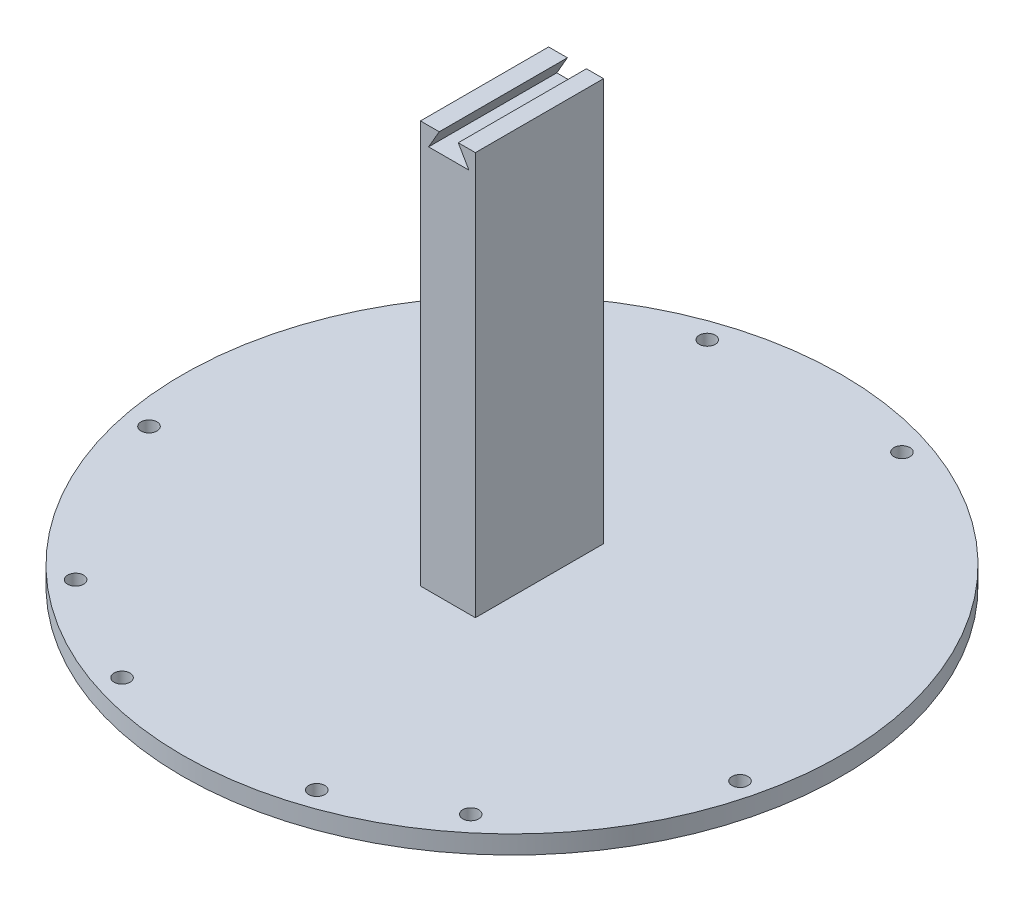
ISO-10303-21;
HEADER;
FILE_DESCRIPTION(('STEP AP214'),'2;1');
FILE_NAME('part.step','',(''),(''),'','','');
FILE_SCHEMA(('AUTOMOTIVE_DESIGN { 1 0 10303 214 1 1 1 1 }'));
ENDSEC;
DATA;
#1=APPLICATION_CONTEXT('core data for automotive mechanical design processes');
#2=APPLICATION_PROTOCOL_DEFINITION('international standard','automotive_design',2000,#1);
#3=PRODUCT_CONTEXT('',#1,'mechanical');
#4=PRODUCT('Part','Part','',(#3));
#5=PRODUCT_RELATED_PRODUCT_CATEGORY('part','',(#4));
#6=PRODUCT_DEFINITION_FORMATION('','',#4);
#7=PRODUCT_DEFINITION_CONTEXT('part definition',#1,'design');
#8=PRODUCT_DEFINITION('design','',#6,#7);
#9=PRODUCT_DEFINITION_SHAPE('','',#8);
#10=(LENGTH_UNIT() NAMED_UNIT(*) SI_UNIT(.MILLI.,.METRE.));
#11=(NAMED_UNIT(*) PLANE_ANGLE_UNIT() SI_UNIT($,.RADIAN.));
#12=(NAMED_UNIT(*) SI_UNIT($,.STERADIAN.) SOLID_ANGLE_UNIT());
#13=UNCERTAINTY_MEASURE_WITH_UNIT(LENGTH_MEASURE(1.E-05),#10,'distance_accuracy_value','');
#14=(GEOMETRIC_REPRESENTATION_CONTEXT(3) GLOBAL_UNCERTAINTY_ASSIGNED_CONTEXT((#13)) GLOBAL_UNIT_ASSIGNED_CONTEXT((#10,
#11,#12)) REPRESENTATION_CONTEXT('',''));
#15=CARTESIAN_POINT('',(0.,0.,0.));
#16=DIRECTION('',(0.,0.,1.));
#17=DIRECTION('',(1.,0.,0.));
#18=AXIS2_PLACEMENT_3D('',#15,#16,#17);
#19=CARTESIAN_POINT('',(0.,115.,0.));
#20=DIRECTION('',(0.,1.,0.));
#21=DIRECTION('',(0.,0.,1.));
#22=AXIS2_PLACEMENT_3D('',#19,#20,#21);
#23=PLANE('',#22);
#24=DIRECTION('',(0.,0.,-1.));
#25=VECTOR('',#24,1.);
#26=CARTESIAN_POINT('',(2.82644831534013,115.,0.));
#27=LINE('',#26,#25);
#28=CARTESIAN_POINT('',(2.82644831534013,115.,17.5));
#29=VERTEX_POINT('',#28);
#30=CARTESIAN_POINT('',(2.82644831534013,115.,-17.5));
#31=VERTEX_POINT('',#30);
#32=EDGE_CURVE('E60',#29,#31,#27,.T.);
#33=ORIENTED_EDGE('',*,*,#32,.F.);
#34=DIRECTION('',(1.,0.,0.));
#35=VECTOR('',#34,1.);
#36=CARTESIAN_POINT('',(7.5,115.,17.5));
#37=LINE('',#36,#35);
#38=CARTESIAN_POINT('',(7.5,115.,17.5));
#39=VERTEX_POINT('',#38);
#40=EDGE_CURVE('E133',#29,#39,#37,.T.);
#41=ORIENTED_EDGE('',*,*,#40,.T.);
#42=DIRECTION('',(0.,0.,-1.));
#43=VECTOR('',#42,1.);
#44=CARTESIAN_POINT('',(7.5,115.,17.5));
#45=LINE('',#44,#43);
#46=CARTESIAN_POINT('',(7.5,115.,-17.5));
#47=VERTEX_POINT('',#46);
#48=EDGE_CURVE('E151',#39,#47,#45,.T.);
#49=ORIENTED_EDGE('',*,*,#48,.T.);
#50=DIRECTION('',(-1.,0.,0.));
#51=VECTOR('',#50,1.);
#52=CARTESIAN_POINT('',(7.5,115.,-17.5));
#53=LINE('',#52,#51);
#54=EDGE_CURVE('E136',#47,#31,#53,.T.);
#55=ORIENTED_EDGE('',*,*,#54,.T.);
#56=EDGE_LOOP('',(#33,#41,#49,#55));
#57=FACE_BOUND('',#56,.T.);
#58=ADVANCED_FACE('F51',(#57),#23,.T.);
#59=CARTESIAN_POINT('',(0.,5.,0.));
#60=DIRECTION('',(0.,-1.,0.));
#61=DIRECTION('',(0.,0.,-1.));
#62=AXIS2_PLACEMENT_3D('',#59,#60,#61);
#63=CYLINDRICAL_SURFACE('',#62,90.);
#64=CARTESIAN_POINT('',(0.,5.,0.));
#65=DIRECTION('',(0.,1.,0.));
#66=DIRECTION('',(0.,0.,1.));
#67=AXIS2_PLACEMENT_3D('',#64,#65,#66);
#68=CIRCLE('',#67,90.);
#69=CARTESIAN_POINT('',(0.,5.,90.));
#70=VERTEX_POINT('',#69);
#71=EDGE_CURVE('E189',#70,#70,#68,.T.);
#72=ORIENTED_EDGE('',*,*,#71,.F.);
#73=EDGE_LOOP('',(#72));
#74=FACE_BOUND('',#73,.T.);
#75=CARTESIAN_POINT('',(0.,0.,0.));
#76=DIRECTION('',(0.,1.,0.));
#77=DIRECTION('',(0.,0.,1.));
#78=AXIS2_PLACEMENT_3D('',#75,#76,#77);
#79=CIRCLE('',#78,90.);
#80=CARTESIAN_POINT('',(0.,0.,90.));
#81=VERTEX_POINT('',#80);
#82=EDGE_CURVE('E188',#81,#81,#79,.T.);
#83=ORIENTED_EDGE('',*,*,#82,.T.);
#84=EDGE_LOOP('',(#83));
#85=FACE_BOUND('',#84,.T.);
#86=ADVANCED_FACE('F53',(#74,#85),#63,.T.);
#87=CARTESIAN_POINT('',(0.,5.,0.));
#88=DIRECTION('',(0.,1.,0.));
#89=DIRECTION('',(0.,0.,1.));
#90=AXIS2_PLACEMENT_3D('',#87,#88,#89);
#91=PLANE('',#90);
#92=CARTESIAN_POINT('',(-82.3103290653493,5.,16.825152102193));
#93=DIRECTION('',(0.,1.,0.));
#94=DIRECTION('',(0.,0.,1.));
#95=AXIS2_PLACEMENT_3D('',#92,#93,#94);
#96=CIRCLE('',#95,2.18255);
#97=CARTESIAN_POINT('',(-82.3103290653493,5.,19.007702102193));
#98=VERTEX_POINT('',#97);
#99=EDGE_CURVE('E129',#98,#98,#96,.T.);
#100=ORIENTED_EDGE('',*,*,#99,.F.);
#101=EDGE_LOOP('',(#100));
#102=FACE_BOUND('',#101,.T.);
#103=CARTESIAN_POINT('',(-56.093218167113,5.,63.0821731492684));
#104=DIRECTION('',(0.,1.,0.));
#105=DIRECTION('',(0.,0.,1.));
#106=AXIS2_PLACEMENT_3D('',#103,#104,#105);
#107=CIRCLE('',#106,2.18255);
#108=CARTESIAN_POINT('',(-56.093218167113,5.,65.2647231492684));
#109=VERTEX_POINT('',#108);
#110=EDGE_CURVE('E230',#109,#109,#107,.T.);
#111=ORIENTED_EDGE('',*,*,#110,.F.);
#112=EDGE_LOOP('',(#111));
#113=FACE_BOUND('',#112,.T.);
#114=CARTESIAN_POINT('',(-26.585,5.,79.9073252514612));
#115=DIRECTION('',(0.,1.,0.));
#116=DIRECTION('',(0.,0.,1.));
#117=AXIS2_PLACEMENT_3D('',#114,#115,#116);
#118=CIRCLE('',#117,2.18255);
#119=CARTESIAN_POINT('',(-26.585,5.,82.0898752514612));
#120=VERTEX_POINT('',#119);
#121=EDGE_CURVE('E234',#120,#120,#118,.T.);
#122=ORIENTED_EDGE('',*,*,#121,.F.);
#123=EDGE_LOOP('',(#122));
#124=FACE_BOUND('',#123,.T.);
#125=CARTESIAN_POINT('',(26.585,5.,79.9073252514612));
#126=DIRECTION('',(0.,1.,0.));
#127=DIRECTION('',(0.,0.,1.));
#128=AXIS2_PLACEMENT_3D('',#125,#126,#127);
#129=CIRCLE('',#128,2.18255);
#130=CARTESIAN_POINT('',(26.585,5.,82.0898752514612));
#131=VERTEX_POINT('',#130);
#132=EDGE_CURVE('E238',#131,#131,#129,.T.);
#133=ORIENTED_EDGE('',*,*,#132,.F.);
#134=EDGE_LOOP('',(#133));
#135=FACE_BOUND('',#134,.T.);
#136=CARTESIAN_POINT('',(82.2453022818043,5.,19.9780897386926));
#137=DIRECTION('',(0.,1.,0.));
#138=DIRECTION('',(0.,0.,1.));
#139=AXIS2_PLACEMENT_3D('',#136,#137,#138);
#140=CIRCLE('',#139,2.18255);
#141=CARTESIAN_POINT('',(82.2453022818043,5.,22.1606397386926));
#142=VERTEX_POINT('',#141);
#143=EDGE_CURVE('E242',#142,#142,#140,.T.);
#144=ORIENTED_EDGE('',*,*,#143,.F.);
#145=EDGE_LOOP('',(#144));
#146=FACE_BOUND('',#145,.T.);
#147=CARTESIAN_POINT('',(53.3465637883439,5.,64.6125029474108));
#148=DIRECTION('',(0.,1.,0.));
#149=DIRECTION('',(0.,0.,1.));
#150=AXIS2_PLACEMENT_3D('',#147,#148,#149);
#151=CIRCLE('',#150,2.18255);
#152=CARTESIAN_POINT('',(53.3465637883439,5.,66.7950529474108));
#153=VERTEX_POINT('',#152);
#154=EDGE_CURVE('E246',#153,#153,#151,.T.);
#155=ORIENTED_EDGE('',*,*,#154,.F.);
#156=EDGE_LOOP('',(#155));
#157=FACE_BOUND('',#156,.T.);
#158=CARTESIAN_POINT('',(26.5850000000001,5.,-79.9073252514612));
#159=DIRECTION('',(0.,1.,0.));
#160=DIRECTION('',(0.,0.,1.));
#161=AXIS2_PLACEMENT_3D('',#158,#159,#160);
#162=CIRCLE('',#161,2.18255);
#163=CARTESIAN_POINT('',(26.5850000000001,5.,-77.7247752514612));
#164=VERTEX_POINT('',#163);
#165=EDGE_CURVE('E250',#164,#164,#162,.T.);
#166=ORIENTED_EDGE('',*,*,#165,.F.);
#167=EDGE_LOOP('',(#166));
#168=FACE_BOUND('',#167,.T.);
#169=CARTESIAN_POINT('',(-26.585,5.,-79.9073252514612));
#170=DIRECTION('',(0.,1.,0.));
#171=DIRECTION('',(0.,0.,1.));
#172=AXIS2_PLACEMENT_3D('',#169,#170,#171);
#173=CIRCLE('',#172,2.18255);
#174=CARTESIAN_POINT('',(-26.585,5.,-77.7247752514612));
#175=VERTEX_POINT('',#174);
#176=EDGE_CURVE('E254',#175,#175,#173,.T.);
#177=ORIENTED_EDGE('',*,*,#176,.F.);
#178=EDGE_LOOP('',(#177));
#179=FACE_BOUND('',#178,.T.);
#180=DIRECTION('',(0.,0.,1.));
#181=VECTOR('',#180,1.);
#182=CARTESIAN_POINT('',(-7.5,5.,17.5));
#183=LINE('',#182,#181);
#184=CARTESIAN_POINT('',(-7.5,5.,-17.5));
#185=VERTEX_POINT('',#184);
#186=CARTESIAN_POINT('',(-7.5,5.,17.5));
#187=VERTEX_POINT('',#186);
#188=EDGE_CURVE('E75',#185,#187,#183,.T.);
#189=ORIENTED_EDGE('',*,*,#188,.F.);
#190=DIRECTION('',(-1.,0.,0.));
#191=VECTOR('',#190,1.);
#192=CARTESIAN_POINT('',(7.5,5.,-17.5));
#193=LINE('',#192,#191);
#194=CARTESIAN_POINT('',(7.5,5.,-17.5));
#195=VERTEX_POINT('',#194);
#196=EDGE_CURVE('E153',#195,#185,#193,.T.);
#197=ORIENTED_EDGE('',*,*,#196,.F.);
#198=DIRECTION('',(0.,0.,-1.));
#199=VECTOR('',#198,1.);
#200=CARTESIAN_POINT('',(7.5,5.,17.5));
#201=LINE('',#200,#199);
#202=CARTESIAN_POINT('',(7.5,5.,17.5));
#203=VERTEX_POINT('',#202);
#204=EDGE_CURVE('E169',#203,#195,#201,.T.);
#205=ORIENTED_EDGE('',*,*,#204,.F.);
#206=DIRECTION('',(1.,0.,0.));
#207=VECTOR('',#206,1.);
#208=CARTESIAN_POINT('',(7.5,5.,17.5));
#209=LINE('',#208,#207);
#210=EDGE_CURVE('E165',#187,#203,#209,.T.);
#211=ORIENTED_EDGE('',*,*,#210,.F.);
#212=EDGE_LOOP('',(#189,#197,#205,#211));
#213=FACE_BOUND('',#212,.T.);
#214=ORIENTED_EDGE('',*,*,#71,.T.);
#215=EDGE_LOOP('',(#214));
#216=FACE_BOUND('',#215,.T.);
#217=ADVANCED_FACE('F296',(#102,#113,#124,#135,#146,#157,#168,#179,#213,#216),#91,.T.);
#218=CARTESIAN_POINT('',(0.,0.,0.));
#219=DIRECTION('',(0.,1.,0.));
#220=DIRECTION('',(0.,0.,1.));
#221=AXIS2_PLACEMENT_3D('',#218,#219,#220);
#222=PLANE('',#221);
#223=CARTESIAN_POINT('',(-82.3103290653493,0.,16.825152102193));
#224=DIRECTION('',(0.,-1.,0.));
#225=DIRECTION('',(0.,0.,-1.));
#226=AXIS2_PLACEMENT_3D('',#223,#224,#225);
#227=CIRCLE('',#226,2.18255);
#228=CARTESIAN_POINT('',(-82.3103290653493,0.,14.642602102193));
#229=VERTEX_POINT('',#228);
#230=EDGE_CURVE('E258',#229,#229,#227,.T.);
#231=ORIENTED_EDGE('',*,*,#230,.F.);
#232=EDGE_LOOP('',(#231));
#233=FACE_BOUND('',#232,.T.);
#234=CARTESIAN_POINT('',(-56.093218167113,0.,63.0821731492684));
#235=DIRECTION('',(0.,-1.,0.));
#236=DIRECTION('',(0.,0.,-1.));
#237=AXIS2_PLACEMENT_3D('',#234,#235,#236);
#238=CIRCLE('',#237,2.18255);
#239=CARTESIAN_POINT('',(-56.093218167113,0.,60.8996231492684));
#240=VERTEX_POINT('',#239);
#241=EDGE_CURVE('E276',#240,#240,#238,.T.);
#242=ORIENTED_EDGE('',*,*,#241,.F.);
#243=EDGE_LOOP('',(#242));
#244=FACE_BOUND('',#243,.T.);
#245=CARTESIAN_POINT('',(-26.585,0.,79.9073252514612));
#246=DIRECTION('',(0.,-1.,0.));
#247=DIRECTION('',(0.,0.,-1.));
#248=AXIS2_PLACEMENT_3D('',#245,#246,#247);
#249=CIRCLE('',#248,2.18255);
#250=CARTESIAN_POINT('',(-26.585,0.,77.7247752514612));
#251=VERTEX_POINT('',#250);
#252=EDGE_CURVE('E280',#251,#251,#249,.T.);
#253=ORIENTED_EDGE('',*,*,#252,.F.);
#254=EDGE_LOOP('',(#253));
#255=FACE_BOUND('',#254,.T.);
#256=CARTESIAN_POINT('',(26.585,0.,79.9073252514612));
#257=DIRECTION('',(0.,-1.,0.));
#258=DIRECTION('',(0.,0.,-1.));
#259=AXIS2_PLACEMENT_3D('',#256,#257,#258);
#260=CIRCLE('',#259,2.18255);
#261=CARTESIAN_POINT('',(26.585,0.,77.7247752514612));
#262=VERTEX_POINT('',#261);
#263=EDGE_CURVE('E264',#262,#262,#260,.T.);
#264=ORIENTED_EDGE('',*,*,#263,.F.);
#265=EDGE_LOOP('',(#264));
#266=FACE_BOUND('',#265,.T.);
#267=CARTESIAN_POINT('',(82.2453022818043,0.,19.9780897386926));
#268=DIRECTION('',(0.,-1.,0.));
#269=DIRECTION('',(0.,0.,-1.));
#270=AXIS2_PLACEMENT_3D('',#267,#268,#269);
#271=CIRCLE('',#270,2.18255);
#272=CARTESIAN_POINT('',(82.2453022818043,0.,17.7955397386926));
#273=VERTEX_POINT('',#272);
#274=EDGE_CURVE('E259',#273,#273,#271,.T.);
#275=ORIENTED_EDGE('',*,*,#274,.F.);
#276=EDGE_LOOP('',(#275));
#277=FACE_BOUND('',#276,.T.);
#278=CARTESIAN_POINT('',(53.3465637883439,0.,64.6125029474108));
#279=DIRECTION('',(0.,-1.,0.));
#280=DIRECTION('',(0.,0.,-1.));
#281=AXIS2_PLACEMENT_3D('',#278,#279,#280);
#282=CIRCLE('',#281,2.18255);
#283=CARTESIAN_POINT('',(53.3465637883439,0.,62.4299529474108));
#284=VERTEX_POINT('',#283);
#285=EDGE_CURVE('E263',#284,#284,#282,.T.);
#286=ORIENTED_EDGE('',*,*,#285,.F.);
#287=EDGE_LOOP('',(#286));
#288=FACE_BOUND('',#287,.T.);
#289=CARTESIAN_POINT('',(26.5850000000001,0.,-79.9073252514612));
#290=DIRECTION('',(0.,-1.,0.));
#291=DIRECTION('',(0.,0.,-1.));
#292=AXIS2_PLACEMENT_3D('',#289,#290,#291);
#293=CIRCLE('',#292,2.18255);
#294=CARTESIAN_POINT('',(26.5850000000001,0.,-82.0898752514612));
#295=VERTEX_POINT('',#294);
#296=EDGE_CURVE('E268',#295,#295,#293,.T.);
#297=ORIENTED_EDGE('',*,*,#296,.F.);
#298=EDGE_LOOP('',(#297));
#299=FACE_BOUND('',#298,.T.);
#300=CARTESIAN_POINT('',(-26.585,0.,-79.9073252514612));
#301=DIRECTION('',(0.,-1.,0.));
#302=DIRECTION('',(0.,0.,-1.));
#303=AXIS2_PLACEMENT_3D('',#300,#301,#302);
#304=CIRCLE('',#303,2.18255);
#305=CARTESIAN_POINT('',(-26.585,0.,-82.0898752514612));
#306=VERTEX_POINT('',#305);
#307=EDGE_CURVE('E272',#306,#306,#304,.T.);
#308=ORIENTED_EDGE('',*,*,#307,.F.);
#309=EDGE_LOOP('',(#308));
#310=FACE_BOUND('',#309,.T.);
#311=ORIENTED_EDGE('',*,*,#82,.F.);
#312=EDGE_LOOP('',(#311));
#313=FACE_BOUND('',#312,.T.);
#314=ADVANCED_FACE('F293',(#233,#244,#255,#266,#277,#288,#299,#310,#313),#222,.F.);
#315=CARTESIAN_POINT('',(-7.5,115.,17.5));
#316=DIRECTION('',(1.,0.,0.));
#317=DIRECTION('',(0.,0.,-1.));
#318=AXIS2_PLACEMENT_3D('',#315,#316,#317);
#319=PLANE('',#318);
#320=ORIENTED_EDGE('',*,*,#188,.T.);
#321=DIRECTION('',(0.,-1.,0.));
#322=VECTOR('',#321,1.);
#323=CARTESIAN_POINT('',(-7.5,115.,17.5));
#324=LINE('',#323,#322);
#325=CARTESIAN_POINT('',(-7.5,115.,17.5));
#326=VERTEX_POINT('',#325);
#327=EDGE_CURVE('E184',#326,#187,#324,.T.);
#328=ORIENTED_EDGE('',*,*,#327,.F.);
#329=DIRECTION('',(0.,0.,1.));
#330=VECTOR('',#329,1.);
#331=CARTESIAN_POINT('',(-7.5,115.,17.5));
#332=LINE('',#331,#330);
#333=CARTESIAN_POINT('',(-7.5,115.,-17.5));
#334=VERTEX_POINT('',#333);
#335=EDGE_CURVE('E146',#334,#326,#332,.T.);
#336=ORIENTED_EDGE('',*,*,#335,.F.);
#337=DIRECTION('',(0.,-1.,0.));
#338=VECTOR('',#337,1.);
#339=CARTESIAN_POINT('',(-7.5,115.,-17.5));
#340=LINE('',#339,#338);
#341=EDGE_CURVE('E162',#334,#185,#340,.T.);
#342=ORIENTED_EDGE('',*,*,#341,.T.);
#343=EDGE_LOOP('',(#320,#328,#336,#342));
#344=FACE_BOUND('',#343,.T.);
#345=ADVANCED_FACE('F210',(#344),#319,.F.);
#346=CARTESIAN_POINT('',(7.5,115.,17.5));
#347=DIRECTION('',(0.,0.,-1.));
#348=DIRECTION('',(-1.,0.,0.));
#349=AXIS2_PLACEMENT_3D('',#346,#347,#348);
#350=PLANE('',#349);
#351=ORIENTED_EDGE('',*,*,#40,.F.);
#352=DIRECTION('',(-0.499999999999996,0.866025403784441,0.));
#353=VECTOR('',#352,1.);
#354=CARTESIAN_POINT('',(2.82644831534013,115.,17.5));
#355=LINE('',#354,#353);
#356=CARTESIAN_POINT('',(5.7264483153401,109.97705265805,17.5));
#357=VERTEX_POINT('',#356);
#358=EDGE_CURVE('E117',#357,#29,#355,.T.);
#359=ORIENTED_EDGE('',*,*,#358,.F.);
#360=DIRECTION('',(1.,0.,0.));
#361=VECTOR('',#360,1.);
#362=CARTESIAN_POINT('',(5.7264483153401,109.97705265805,17.5));
#363=LINE('',#362,#361);
#364=CARTESIAN_POINT('',(-5.2735516846599,109.97705265805,17.5));
#365=VERTEX_POINT('',#364);
#366=EDGE_CURVE('E202',#365,#357,#363,.T.);
#367=ORIENTED_EDGE('',*,*,#366,.F.);
#368=DIRECTION('',(-0.500000000000006,-0.866025403784435,0.));
#369=VECTOR('',#368,1.);
#370=CARTESIAN_POINT('',(-5.2735516846599,109.97705265805,17.5));
#371=LINE('',#370,#369);
#372=CARTESIAN_POINT('',(-2.37355168465986,115.,17.5));
#373=VERTEX_POINT('',#372);
#374=EDGE_CURVE('E128',#373,#365,#371,.T.);
#375=ORIENTED_EDGE('',*,*,#374,.F.);
#376=EDGE_CURVE('E145',#326,#373,#37,.T.);
#377=ORIENTED_EDGE('',*,*,#376,.F.);
#378=ORIENTED_EDGE('',*,*,#327,.T.);
#379=ORIENTED_EDGE('',*,*,#210,.T.);
#380=DIRECTION('',(0.,-1.,0.));
#381=VECTOR('',#380,1.);
#382=CARTESIAN_POINT('',(7.5,115.,17.5));
#383=LINE('',#382,#381);
#384=EDGE_CURVE('E142',#39,#203,#383,.T.);
#385=ORIENTED_EDGE('',*,*,#384,.F.);
#386=EDGE_LOOP('',(#351,#359,#367,#375,#377,#378,#379,#385));
#387=FACE_BOUND('',#386,.T.);
#388=ADVANCED_FACE('F139',(#387),#350,.F.);
#389=CARTESIAN_POINT('',(7.5,115.,17.5));
#390=DIRECTION('',(-1.,0.,0.));
#391=DIRECTION('',(0.,0.,1.));
#392=AXIS2_PLACEMENT_3D('',#389,#390,#391);
#393=PLANE('',#392);
#394=ORIENTED_EDGE('',*,*,#204,.T.);
#395=DIRECTION('',(0.,-1.,0.));
#396=VECTOR('',#395,1.);
#397=CARTESIAN_POINT('',(7.5,115.,-17.5));
#398=LINE('',#397,#396);
#399=EDGE_CURVE('E178',#47,#195,#398,.T.);
#400=ORIENTED_EDGE('',*,*,#399,.F.);
#401=ORIENTED_EDGE('',*,*,#48,.F.);
#402=ORIENTED_EDGE('',*,*,#384,.T.);
#403=EDGE_LOOP('',(#394,#400,#401,#402));
#404=FACE_BOUND('',#403,.T.);
#405=ADVANCED_FACE('F212',(#404),#393,.F.);
#406=CARTESIAN_POINT('',(7.5,115.,-17.5));
#407=DIRECTION('',(0.,0.,1.));
#408=DIRECTION('',(1.,0.,0.));
#409=AXIS2_PLACEMENT_3D('',#406,#407,#408);
#410=PLANE('',#409);
#411=DIRECTION('',(1.,0.,0.));
#412=VECTOR('',#411,1.);
#413=CARTESIAN_POINT('',(7.5,109.97705265805,-17.5));
#414=LINE('',#413,#412);
#415=CARTESIAN_POINT('',(-5.2735516846599,109.97705265805,-17.5));
#416=VERTEX_POINT('',#415);
#417=CARTESIAN_POINT('',(5.7264483153401,109.97705265805,-17.5));
#418=VERTEX_POINT('',#417);
#419=EDGE_CURVE('E12',#416,#418,#414,.T.);
#420=ORIENTED_EDGE('',*,*,#419,.T.);
#421=DIRECTION('',(-0.499999999999996,0.866025403784441,0.));
#422=VECTOR('',#421,1.);
#423=CARTESIAN_POINT('',(3.99483623650507,112.976292757593,-17.5));
#424=LINE('',#423,#422);
#425=EDGE_CURVE('E166',#418,#31,#424,.T.);
#426=ORIENTED_EDGE('',*,*,#425,.T.);
#427=ORIENTED_EDGE('',*,*,#54,.F.);
#428=ORIENTED_EDGE('',*,*,#399,.T.);
#429=ORIENTED_EDGE('',*,*,#196,.T.);
#430=ORIENTED_EDGE('',*,*,#341,.F.);
#431=CARTESIAN_POINT('',(-2.37355168465984,115.,-17.5));
#432=VERTEX_POINT('',#431);
#433=EDGE_CURVE('E159',#432,#334,#53,.T.);
#434=ORIENTED_EDGE('',*,*,#433,.F.);
#435=DIRECTION('',(-0.500000000000006,-0.866025403784435,0.));
#436=VECTOR('',#435,1.);
#437=CARTESIAN_POINT('',(0.0948362365051714,119.275373292247,-17.5));
#438=LINE('',#437,#436);
#439=EDGE_CURVE('E67',#432,#416,#438,.T.);
#440=ORIENTED_EDGE('',*,*,#439,.T.);
#441=EDGE_LOOP('',(#420,#426,#427,#428,#429,#430,#434,#440));
#442=FACE_BOUND('',#441,.T.);
#443=ADVANCED_FACE('F215',(#442),#410,.F.);
#444=DIRECTION('',(0.,0.,1.));
#445=VECTOR('',#444,1.);
#446=CARTESIAN_POINT('',(-2.37355168465984,115.,0.));
#447=LINE('',#446,#445);
#448=EDGE_CURVE('E138',#432,#373,#447,.T.);
#449=ORIENTED_EDGE('',*,*,#448,.F.);
#450=ORIENTED_EDGE('',*,*,#433,.T.);
#451=ORIENTED_EDGE('',*,*,#335,.T.);
#452=ORIENTED_EDGE('',*,*,#376,.T.);
#453=EDGE_LOOP('',(#449,#450,#451,#452));
#454=FACE_BOUND('',#453,.T.);
#455=ADVANCED_FACE('F205',(#454),#23,.T.);
#456=CARTESIAN_POINT('',(5.7264483153401,109.97705265805,-18.5));
#457=DIRECTION('',(0.,-1.,0.));
#458=DIRECTION('',(0.,0.,-1.));
#459=AXIS2_PLACEMENT_3D('',#456,#457,#458);
#460=PLANE('',#459);
#461=DIRECTION('',(0.,0.,1.));
#462=VECTOR('',#461,1.);
#463=CARTESIAN_POINT('',(-5.2735516846599,109.97705265805,-18.5));
#464=LINE('',#463,#462);
#465=EDGE_CURVE('E220',#416,#365,#464,.T.);
#466=ORIENTED_EDGE('',*,*,#465,.T.);
#467=ORIENTED_EDGE('',*,*,#366,.T.);
#468=DIRECTION('',(0.,0.,1.));
#469=VECTOR('',#468,1.);
#470=CARTESIAN_POINT('',(5.7264483153401,109.97705265805,-18.5));
#471=LINE('',#470,#469);
#472=EDGE_CURVE('E122',#418,#357,#471,.T.);
#473=ORIENTED_EDGE('',*,*,#472,.F.);
#474=ORIENTED_EDGE('',*,*,#419,.F.);
#475=EDGE_LOOP('',(#466,#467,#473,#474));
#476=FACE_BOUND('',#475,.T.);
#477=ADVANCED_FACE('F329',(#476),#460,.F.);
#478=CARTESIAN_POINT('',(2.82644831534013,115.,-18.5));
#479=DIRECTION('',(0.866025403784441,0.499999999999996,0.));
#480=DIRECTION('',(-0.499999999999996,0.866025403784441,0.));
#481=AXIS2_PLACEMENT_3D('',#478,#479,#480);
#482=PLANE('',#481);
#483=ORIENTED_EDGE('',*,*,#472,.T.);
#484=ORIENTED_EDGE('',*,*,#358,.T.);
#485=ORIENTED_EDGE('',*,*,#32,.T.);
#486=ORIENTED_EDGE('',*,*,#425,.F.);
#487=EDGE_LOOP('',(#483,#484,#485,#486));
#488=FACE_BOUND('',#487,.T.);
#489=ADVANCED_FACE('F119',(#488),#482,.F.);
#490=CARTESIAN_POINT('',(-5.2735516846599,109.97705265805,-18.5));
#491=DIRECTION('',(-0.866025403784435,0.500000000000006,0.));
#492=DIRECTION('',(-0.500000000000006,-0.866025403784435,0.));
#493=AXIS2_PLACEMENT_3D('',#490,#491,#492);
#494=PLANE('',#493);
#495=ORIENTED_EDGE('',*,*,#448,.T.);
#496=ORIENTED_EDGE('',*,*,#374,.T.);
#497=ORIENTED_EDGE('',*,*,#465,.F.);
#498=ORIENTED_EDGE('',*,*,#439,.F.);
#499=EDGE_LOOP('',(#495,#496,#497,#498));
#500=FACE_BOUND('',#499,.T.);
#501=ADVANCED_FACE('F199',(#500),#494,.F.);
#502=CARTESIAN_POINT('',(-26.585,62.,-79.9073252514612));
#503=DIRECTION('',(0.,-1.,0.));
#504=DIRECTION('',(0.,0.,-1.));
#505=AXIS2_PLACEMENT_3D('',#502,#503,#504);
#506=CYLINDRICAL_SURFACE('',#505,2.18255);
#507=ORIENTED_EDGE('',*,*,#176,.T.);
#508=EDGE_LOOP('',(#507));
#509=FACE_BOUND('',#508,.T.);
#510=ORIENTED_EDGE('',*,*,#307,.T.);
#511=EDGE_LOOP('',(#510));
#512=FACE_BOUND('',#511,.T.);
#513=ADVANCED_FACE('F386',(#509,#512),#506,.F.);
#514=CARTESIAN_POINT('',(26.5850000000001,62.,-79.9073252514612));
#515=DIRECTION('',(0.,-1.,0.));
#516=DIRECTION('',(0.,0.,-1.));
#517=AXIS2_PLACEMENT_3D('',#514,#515,#516);
#518=CYLINDRICAL_SURFACE('',#517,2.18255);
#519=ORIENTED_EDGE('',*,*,#165,.T.);
#520=EDGE_LOOP('',(#519));
#521=FACE_BOUND('',#520,.T.);
#522=ORIENTED_EDGE('',*,*,#296,.T.);
#523=EDGE_LOOP('',(#522));
#524=FACE_BOUND('',#523,.T.);
#525=ADVANCED_FACE('F395',(#521,#524),#518,.F.);
#526=CARTESIAN_POINT('',(53.3465637883439,62.,64.6125029474108));
#527=DIRECTION('',(0.,-1.,0.));
#528=DIRECTION('',(0.,0.,-1.));
#529=AXIS2_PLACEMENT_3D('',#526,#527,#528);
#530=CYLINDRICAL_SURFACE('',#529,2.18255);
#531=ORIENTED_EDGE('',*,*,#154,.T.);
#532=EDGE_LOOP('',(#531));
#533=FACE_BOUND('',#532,.T.);
#534=ORIENTED_EDGE('',*,*,#285,.T.);
#535=EDGE_LOOP('',(#534));
#536=FACE_BOUND('',#535,.T.);
#537=ADVANCED_FACE('F405',(#533,#536),#530,.F.);
#538=CARTESIAN_POINT('',(82.2453022818043,62.,19.9780897386926));
#539=DIRECTION('',(0.,-1.,0.));
#540=DIRECTION('',(0.,0.,-1.));
#541=AXIS2_PLACEMENT_3D('',#538,#539,#540);
#542=CYLINDRICAL_SURFACE('',#541,2.18255);
#543=ORIENTED_EDGE('',*,*,#143,.T.);
#544=EDGE_LOOP('',(#543));
#545=FACE_BOUND('',#544,.T.);
#546=ORIENTED_EDGE('',*,*,#274,.T.);
#547=EDGE_LOOP('',(#546));
#548=FACE_BOUND('',#547,.T.);
#549=ADVANCED_FACE('F414',(#545,#548),#542,.F.);
#550=CARTESIAN_POINT('',(26.585,62.,79.9073252514612));
#551=DIRECTION('',(0.,-1.,0.));
#552=DIRECTION('',(0.,0.,-1.));
#553=AXIS2_PLACEMENT_3D('',#550,#551,#552);
#554=CYLINDRICAL_SURFACE('',#553,2.18255);
#555=ORIENTED_EDGE('',*,*,#132,.T.);
#556=EDGE_LOOP('',(#555));
#557=FACE_BOUND('',#556,.T.);
#558=ORIENTED_EDGE('',*,*,#263,.T.);
#559=EDGE_LOOP('',(#558));
#560=FACE_BOUND('',#559,.T.);
#561=ADVANCED_FACE('F423',(#557,#560),#554,.F.);
#562=CARTESIAN_POINT('',(-26.585,62.,79.9073252514612));
#563=DIRECTION('',(0.,-1.,0.));
#564=DIRECTION('',(0.,0.,-1.));
#565=AXIS2_PLACEMENT_3D('',#562,#563,#564);
#566=CYLINDRICAL_SURFACE('',#565,2.18255);
#567=ORIENTED_EDGE('',*,*,#121,.T.);
#568=EDGE_LOOP('',(#567));
#569=FACE_BOUND('',#568,.T.);
#570=ORIENTED_EDGE('',*,*,#252,.T.);
#571=EDGE_LOOP('',(#570));
#572=FACE_BOUND('',#571,.T.);
#573=ADVANCED_FACE('F432',(#569,#572),#566,.F.);
#574=CARTESIAN_POINT('',(-56.093218167113,62.,63.0821731492684));
#575=DIRECTION('',(0.,-1.,0.));
#576=DIRECTION('',(0.,0.,-1.));
#577=AXIS2_PLACEMENT_3D('',#574,#575,#576);
#578=CYLINDRICAL_SURFACE('',#577,2.18255);
#579=ORIENTED_EDGE('',*,*,#110,.T.);
#580=EDGE_LOOP('',(#579));
#581=FACE_BOUND('',#580,.T.);
#582=ORIENTED_EDGE('',*,*,#241,.T.);
#583=EDGE_LOOP('',(#582));
#584=FACE_BOUND('',#583,.T.);
#585=ADVANCED_FACE('F441',(#581,#584),#578,.F.);
#586=CARTESIAN_POINT('',(-82.3103290653493,62.,16.825152102193));
#587=DIRECTION('',(0.,-1.,0.));
#588=DIRECTION('',(0.,0.,-1.));
#589=AXIS2_PLACEMENT_3D('',#586,#587,#588);
#590=CYLINDRICAL_SURFACE('',#589,2.18255);
#591=ORIENTED_EDGE('',*,*,#99,.T.);
#592=EDGE_LOOP('',(#591));
#593=FACE_BOUND('',#592,.T.);
#594=ORIENTED_EDGE('',*,*,#230,.T.);
#595=EDGE_LOOP('',(#594));
#596=FACE_BOUND('',#595,.T.);
#597=ADVANCED_FACE('F291',(#593,#596),#590,.F.);
#598=CLOSED_SHELL('',(#58,#86,#217,#314,#345,#388,#405,#443,#455,#477,#489,#501,#513,#525,#537,
#549,#561,#573,#585,#597));
#599=MANIFOLD_SOLID_BREP('B2',#598);
#600=ADVANCED_BREP_SHAPE_REPRESENTATION('',(#18,#599),#14);
#601=SHAPE_DEFINITION_REPRESENTATION(#9,#600);
ENDSEC;
END-ISO-10303-21;
